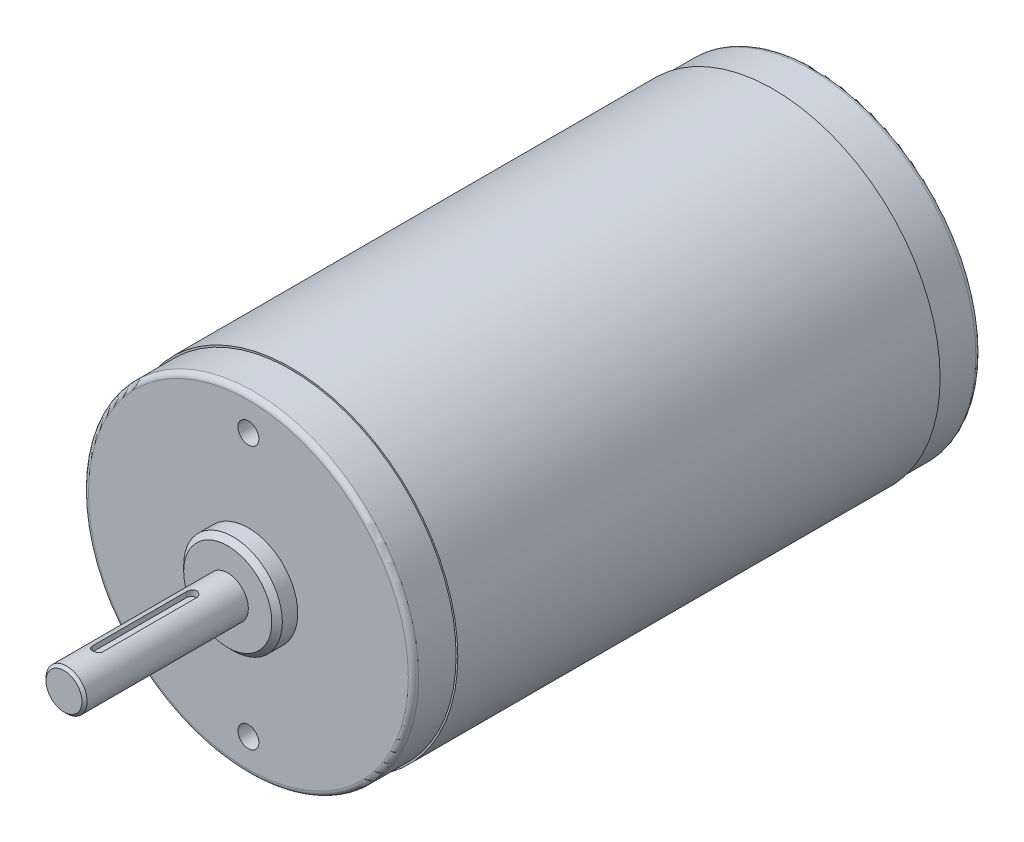
ISO-10303-21;
HEADER;
FILE_DESCRIPTION(('STEP AP214'),'2;1');
FILE_NAME('part.step','',(''),(''),'','','');
FILE_SCHEMA(('AUTOMOTIVE_DESIGN { 1 0 10303 214 1 1 1 1 }'));
ENDSEC;
DATA;
#1=APPLICATION_CONTEXT('core data for automotive mechanical design processes');
#2=APPLICATION_PROTOCOL_DEFINITION('international standard','automotive_design',2000,#1);
#3=PRODUCT_CONTEXT('',#1,'mechanical');
#4=PRODUCT('Part','Part','',(#3));
#5=PRODUCT_RELATED_PRODUCT_CATEGORY('part','',(#4));
#6=PRODUCT_DEFINITION_FORMATION('','',#4);
#7=PRODUCT_DEFINITION_CONTEXT('part definition',#1,'design');
#8=PRODUCT_DEFINITION('design','',#6,#7);
#9=PRODUCT_DEFINITION_SHAPE('','',#8);
#10=(LENGTH_UNIT() NAMED_UNIT(*) SI_UNIT(.MILLI.,.METRE.));
#11=(NAMED_UNIT(*) PLANE_ANGLE_UNIT() SI_UNIT($,.RADIAN.));
#12=(NAMED_UNIT(*) SI_UNIT($,.STERADIAN.) SOLID_ANGLE_UNIT());
#13=UNCERTAINTY_MEASURE_WITH_UNIT(LENGTH_MEASURE(1.E-05),#10,'distance_accuracy_value','');
#14=(GEOMETRIC_REPRESENTATION_CONTEXT(3) GLOBAL_UNCERTAINTY_ASSIGNED_CONTEXT((#13)) GLOBAL_UNIT_ASSIGNED_CONTEXT((#10,
#11,#12)) REPRESENTATION_CONTEXT('',''));
#15=CARTESIAN_POINT('',(0.,0.,0.));
#16=DIRECTION('',(0.,0.,1.));
#17=DIRECTION('',(1.,0.,0.));
#18=AXIS2_PLACEMENT_3D('',#15,#16,#17);
#19=CARTESIAN_POINT('',(0.,31.877,-113.5888));
#20=DIRECTION('',(0.,0.,1.));
#21=DIRECTION('',(1.,0.,0.));
#22=AXIS2_PLACEMENT_3D('',#19,#20,#21);
#23=PLANE('',#22);
#24=CARTESIAN_POINT('',(-11.1850818728217,18.6151022693478,-113.5888));
#25=DIRECTION('',(0.,0.,1.));
#26=DIRECTION('',(1.,0.,0.));
#27=AXIS2_PLACEMENT_3D('',#24,#25,#26);
#28=CIRCLE('',#27,4.318);
#29=CARTESIAN_POINT('',(-6.86708187282167,18.6151022693478,-113.5888));
#30=VERTEX_POINT('',#29);
#31=EDGE_CURVE('E46',#30,#30,#28,.F.);
#32=ORIENTED_EDGE('',*,*,#31,.F.);
#33=EDGE_LOOP('',(#32));
#34=FACE_BOUND('',#33,.T.);
#35=CARTESIAN_POINT('',(0.,0.,-113.5888));
#36=DIRECTION('',(0.,0.,1.));
#37=DIRECTION('',(1.,0.,0.));
#38=AXIS2_PLACEMENT_3D('',#35,#36,#37);
#39=CIRCLE('',#38,30.877);
#40=CARTESIAN_POINT('',(30.877,0.,-113.5888));
#41=VERTEX_POINT('',#40);
#42=EDGE_CURVE('E149',#41,#41,#39,.F.);
#43=ORIENTED_EDGE('',*,*,#42,.T.);
#44=EDGE_LOOP('',(#43));
#45=FACE_BOUND('',#44,.T.);
#46=CARTESIAN_POINT('',(0.,0.,-113.5888));
#47=DIRECTION('',(0.,0.,1.));
#48=DIRECTION('',(1.,0.,0.));
#49=AXIS2_PLACEMENT_3D('',#46,#47,#48);
#50=CIRCLE('',#49,15.0368);
#51=CARTESIAN_POINT('',(15.0368,0.,-113.5888));
#52=VERTEX_POINT('',#51);
#53=EDGE_CURVE('E125',#52,#52,#50,.T.);
#54=ORIENTED_EDGE('',*,*,#53,.T.);
#55=EDGE_LOOP('',(#54));
#56=FACE_BOUND('',#55,.T.);
#57=CARTESIAN_POINT('',(-18.6151022693478,11.1850818728216,-113.5888));
#58=DIRECTION('',(0.,0.,1.));
#59=DIRECTION('',(1.,0.,0.));
#60=AXIS2_PLACEMENT_3D('',#57,#58,#59);
#61=CIRCLE('',#60,4.318);
#62=CARTESIAN_POINT('',(-14.2971022693478,11.1850818728216,-113.5888));
#63=VERTEX_POINT('',#62);
#64=EDGE_CURVE('E11',#63,#63,#61,.F.);
#65=ORIENTED_EDGE('',*,*,#64,.F.);
#66=EDGE_LOOP('',(#65));
#67=FACE_BOUND('',#66,.T.);
#68=ADVANCED_FACE('F38',(#34,#45,#56,#67),#23,.F.);
#69=CARTESIAN_POINT('',(0.,0.,31.623));
#70=DIRECTION('',(0.,0.,-1.));
#71=DIRECTION('',(-1.,0.,0.));
#72=AXIS2_PLACEMENT_3D('',#69,#70,#71);
#73=PLANE('',#72);
#74=CARTESIAN_POINT('',(0.,0.,31.623));
#75=DIRECTION('',(0.,0.,-1.));
#76=DIRECTION('',(-1.,0.,0.));
#77=AXIS2_PLACEMENT_3D('',#74,#75,#76);
#78=CIRCLE('',#77,3.47510000000003);
#79=CARTESIAN_POINT('',(-3.47510000000003,0.,31.623));
#80=VERTEX_POINT('',#79);
#81=EDGE_CURVE('E170',#80,#80,#78,.F.);
#82=ORIENTED_EDGE('',*,*,#81,.T.);
#83=EDGE_LOOP('',(#82));
#84=FACE_BOUND('',#83,.T.);
#85=ADVANCED_FACE('F222',(#84),#73,.F.);
#86=CARTESIAN_POINT('',(0.,0.,111.866494726052));
#87=DIRECTION('',(0.,0.,1.));
#88=DIRECTION('',(1.,0.,0.));
#89=AXIS2_PLACEMENT_3D('',#86,#87,#88);
#90=CYLINDRICAL_SURFACE('',#89,3.9751);
#91=DIRECTION('',(0.,0.,1.));
#92=VECTOR('',#91,1.);
#93=CARTESIAN_POINT('',(-0.999490000000012,3.84739389066157,111.866494726052));
#94=LINE('',#93,#92);
#95=CARTESIAN_POINT('',(-0.999490000000002,3.84739389066157,25.09393));
#96=VERTEX_POINT('',#95);
#97=CARTESIAN_POINT('',(-0.99949,3.84739389066157,6.99389));
#98=VERTEX_POINT('',#97);
#99=EDGE_CURVE('E189',#96,#98,#94,.F.);
#100=ORIENTED_EDGE('',*,*,#99,.T.);
#101=CARTESIAN_POINT('',(-0.99949,3.84739389066157,6.99389));
#102=CARTESIAN_POINT('',(-0.999490343381308,3.8473920181115,6.96624660485243));
#103=CARTESIAN_POINT('',(-0.998342448217711,3.84769219472429,6.9386169129116));
#104=CARTESIAN_POINT('',(-0.993766503056189,3.84887729877351,6.88356427524025));
#105=CARTESIAN_POINT('',(-0.990338840053046,3.84976212696408,6.8561412952189));
#106=CARTESIAN_POINT('',(-0.976686297375432,3.85325802345764,6.77459379441145));
#107=CARTESIAN_POINT('',(-0.963091643256898,3.85671072402567,6.72102982738385));
#108=CARTESIAN_POINT('',(-0.927356949827813,3.86545763452847,6.61703857790982));
#109=CARTESIAN_POINT('',(-0.905217770127287,3.87075165921411,6.56661098052568));
#110=CARTESIAN_POINT('',(-0.85304929208549,3.88258162245654,6.47016009313009));
#111=CARTESIAN_POINT('',(-0.823017836794074,3.88911790038437,6.42413801183939));
#112=CARTESIAN_POINT('',(-0.755211368536713,3.90285700660392,6.33681077481703));
#113=CARTESIAN_POINT('',(-0.717294003960189,3.91007051997266,6.29561785872324));
#114=CARTESIAN_POINT('',(-0.635095100783287,3.92425930132188,6.22010074654109));
#115=CARTESIAN_POINT('',(-0.590812545589344,3.93123453102508,6.18577764974018));
#116=CARTESIAN_POINT('',(-0.496367579344913,3.94427940521958,6.12451583290973));
#117=CARTESIAN_POINT('',(-0.446130988567747,3.95033487574501,6.09768819630616));
#118=CARTESIAN_POINT('',(-0.341685942109306,3.96073487028167,6.05290223136462));
#119=CARTESIAN_POINT('',(-0.287478276859873,3.96507973369311,6.03494214344343));
#120=CARTESIAN_POINT('',(-0.177805168599244,3.9714933735354,6.00876128510268));
#121=CARTESIAN_POINT('',(-0.122388179838444,3.97360691689222,6.00034869361091));
#122=CARTESIAN_POINT('',(-0.0108906250515875,3.97547584784663,5.99289933101057));
#123=CARTESIAN_POINT('',(0.0451898555511955,3.97523153578354,5.99386136577937));
#124=CARTESIAN_POINT('',(0.155089151279945,3.97244547098542,6.00499659245638));
#125=CARTESIAN_POINT('',(0.208930476121442,3.96995541867523,6.01496251002972));
#126=CARTESIAN_POINT('',(0.314150158804952,3.9630179639741,6.04348918980516));
#127=CARTESIAN_POINT('',(0.36552840684914,3.95857047441531,6.06205033476867));
#128=CARTESIAN_POINT('',(0.464909318541839,3.94813892179605,6.1074077795047));
#129=CARTESIAN_POINT('',(0.512876879695035,3.94214120031962,6.13427772028273));
#130=CARTESIAN_POINT('',(0.603693451036629,3.92925961138905,6.19543360284162));
#131=CARTESIAN_POINT('',(0.646541677963807,3.92237560866724,6.22972067719859));
#132=CARTESIAN_POINT('',(0.727136245277363,3.90824954837472,6.30584301121543));
#133=CARTESIAN_POINT('',(0.764711621366916,3.90100284589063,6.34785859055966));
#134=CARTESIAN_POINT('',(0.832330340627265,3.88713794728399,6.43768265952907));
#135=CARTESIAN_POINT('',(0.86237162079384,3.88051992361527,6.48549273051177));
#136=CARTESIAN_POINT('',(0.914182904910808,3.86864352215989,6.58589479391042));
#137=CARTESIAN_POINT('',(0.935906633198786,3.86339280178735,6.63851157872597));
#138=CARTESIAN_POINT('',(0.970118778767975,3.85494556552529,6.74678340361034));
#139=CARTESIAN_POINT('',(0.982621006766666,3.85174597866952,6.80243376559792));
#140=CARTESIAN_POINT('',(0.993366859861364,3.8489802595001,6.88112091104182));
#141=CARTESIAN_POINT('',(0.995663418329813,3.84838629979331,6.90362800905635));
#142=CARTESIAN_POINT('',(0.998723272563294,3.84759328590928,6.9487164977706));
#143=CARTESIAN_POINT('',(0.999489044854608,3.84739359388698,6.97129770917706));
#144=CARTESIAN_POINT('',(0.99949,3.84739389066157,6.99389));
#145=B_SPLINE_CURVE_WITH_KNOTS('',3,(#101,#102,#103,#104,#105,#106,#107,#108,#109,#110,#111,
#112,#113,#114,#115,#116,#117,#118,#119,#120,#121,#122,#123,#124,#125,#126,#127,#128,#129,#130,
#131,#132,#133,#134,#135,#136,#137,#138,#139,#140,#141,#142,#143,#144),.UNSPECIFIED.,.F.,.F.,(4,
2,2,2,2,2,2,2,2,2,2,2,2,2,2,2,2,2,2,2,2,4),(0.,0.0828777794645352,0.165741493863067,
0.330992570166975,0.496227025949619,0.661506687172767,0.830079138702128,0.998678543151512,
1.16965802381187,1.34060356345095,1.5080501726355,1.67547545305815,1.83914205422299,
2.00281594446593,2.167984203063,2.33317770022889,2.50287539431904,2.67261950482898,
2.8432947390248,3.01371383698304,3.08156469810441,3.14930570007196),.UNSPECIFIED.);
#146=CARTESIAN_POINT('',(0.99949,3.84739389066158,6.99389));
#147=VERTEX_POINT('',#146);
#148=EDGE_CURVE('E211',#98,#147,#145,.T.);
#149=ORIENTED_EDGE('',*,*,#148,.T.);
#150=DIRECTION('',(0.,0.,1.));
#151=VECTOR('',#150,1.);
#152=CARTESIAN_POINT('',(0.999489999999984,3.84739389066158,111.866494726052));
#153=LINE('',#152,#151);
#154=CARTESIAN_POINT('',(0.999489999999984,3.84739389066158,25.09393));
#155=VERTEX_POINT('',#154);
#156=EDGE_CURVE('E85',#147,#155,#153,.T.);
#157=ORIENTED_EDGE('',*,*,#156,.T.);
#158=CARTESIAN_POINT('',(0.999489999999997,3.84739389066157,25.09393));
#159=CARTESIAN_POINT('',(0.999490343381305,3.8473920181115,25.1215733951476));
#160=CARTESIAN_POINT('',(0.998342448217708,3.84769219472429,25.1492030870884));
#161=CARTESIAN_POINT('',(0.993766503056185,3.84887729877351,25.2042557247598));
#162=CARTESIAN_POINT('',(0.990338840053042,3.84976212696409,25.2316787047811));
#163=CARTESIAN_POINT('',(0.976686297375429,3.85325802345764,25.3132262055885));
#164=CARTESIAN_POINT('',(0.963091643256895,3.85671072402567,25.3667901726161));
#165=CARTESIAN_POINT('',(0.927356949827811,3.86545763452847,25.4707814220902));
#166=CARTESIAN_POINT('',(0.905217770127285,3.87075165921411,25.5212090194743));
#167=CARTESIAN_POINT('',(0.853049292085487,3.88258162245654,25.6176599068699));
#168=CARTESIAN_POINT('',(0.823017836794071,3.88911790038437,25.6636819881606));
#169=CARTESIAN_POINT('',(0.755211368536709,3.90285700660392,25.751009225183));
#170=CARTESIAN_POINT('',(0.717294003960184,3.91007051997266,25.7922021412768));
#171=CARTESIAN_POINT('',(0.635095100783281,3.92425930132188,25.8677192534589));
#172=CARTESIAN_POINT('',(0.590812545589338,3.93123453102508,25.9020423502598));
#173=CARTESIAN_POINT('',(0.496367579344908,3.94427940521958,25.9633041670903));
#174=CARTESIAN_POINT('',(0.446130988567742,3.95033487574501,25.9901318036938));
#175=CARTESIAN_POINT('',(0.341685942109302,3.96073487028167,26.0349177686354));
#176=CARTESIAN_POINT('',(0.287478276859869,3.96507973369311,26.0528778565566));
#177=CARTESIAN_POINT('',(0.177805168599242,3.9714933735354,26.0790587148973));
#178=CARTESIAN_POINT('',(0.122388179838441,3.97360691689222,26.0874713063891));
#179=CARTESIAN_POINT('',(0.010890625051585,3.97547584784663,26.0949206689894));
#180=CARTESIAN_POINT('',(-0.045189855551198,3.97523153578354,26.0939586342206));
#181=CARTESIAN_POINT('',(-0.155089151279948,3.97244547098542,26.0828234075436));
#182=CARTESIAN_POINT('',(-0.208930476121444,3.96995541867523,26.0728574899703));
#183=CARTESIAN_POINT('',(-0.314150158804955,3.9630179639741,26.0443308101948));
#184=CARTESIAN_POINT('',(-0.365528406849143,3.95857047441531,26.0257696652313));
#185=CARTESIAN_POINT('',(-0.464909318541841,3.94813892179605,25.9804122204953));
#186=CARTESIAN_POINT('',(-0.512876879695037,3.94214120031962,25.9535422797173));
#187=CARTESIAN_POINT('',(-0.603693451036631,3.92925961138905,25.8923863971584));
#188=CARTESIAN_POINT('',(-0.64654167796381,3.92237560866724,25.8580993228014));
#189=CARTESIAN_POINT('',(-0.727136245277367,3.90824954837472,25.7819769887846));
#190=CARTESIAN_POINT('',(-0.764711621366919,3.90100284589063,25.7399614094403));
#191=CARTESIAN_POINT('',(-0.832330340627268,3.88713794728399,25.6501373404709));
#192=CARTESIAN_POINT('',(-0.862371620793843,3.88051992361527,25.6023272694882));
#193=CARTESIAN_POINT('',(-0.914182904910811,3.86864352215989,25.5019252060896));
#194=CARTESIAN_POINT('',(-0.935906633198789,3.86339280178735,25.449308421274));
#195=CARTESIAN_POINT('',(-0.970118778767978,3.85494556552529,25.3410365963897));
#196=CARTESIAN_POINT('',(-0.98262100676667,3.85174597866952,25.2853862344021));
#197=CARTESIAN_POINT('',(-0.993366859861367,3.8489802595001,25.2066990889582));
#198=CARTESIAN_POINT('',(-0.995663418329815,3.84838629979331,25.1841919909436));
#199=CARTESIAN_POINT('',(-0.998723272563297,3.84759328590928,25.1391035022294));
#200=CARTESIAN_POINT('',(-0.99948904485461,3.84739359388698,25.1165222908229));
#201=CARTESIAN_POINT('',(-0.999490000000002,3.84739389066157,25.09393));
#202=B_SPLINE_CURVE_WITH_KNOTS('',3,(#158,#159,#160,#161,#162,#163,#164,#165,#166,#167,#168,
#169,#170,#171,#172,#173,#174,#175,#176,#177,#178,#179,#180,#181,#182,#183,#184,#185,#186,#187,
#188,#189,#190,#191,#192,#193,#194,#195,#196,#197,#198,#199,#200,#201),.UNSPECIFIED.,.F.,.F.,(4,
2,2,2,2,2,2,2,2,2,2,2,2,2,2,2,2,2,2,2,2,4),(0.,0.0828777794645343,0.165741493863063,
0.330992570166974,0.496227025949618,0.661506687172766,0.830079138702133,0.998678543151515,
1.16965802381187,1.34060356345095,1.5080501726355,1.67547545305815,1.83914205422299,
2.00281594446593,2.167984203063,2.33317770022888,2.50287539431904,2.67261950482898,
2.8432947390248,3.01371383698304,3.0815646981044,3.14930570007196),.UNSPECIFIED.);
#203=EDGE_CURVE('E181',#155,#96,#202,.T.);
#204=ORIENTED_EDGE('',*,*,#203,.T.);
#205=EDGE_LOOP('',(#100,#149,#157,#204));
#206=FACE_BOUND('',#205,.T.);
#207=CARTESIAN_POINT('',(0.,0.,31.123));
#208=DIRECTION('',(0.,0.,-1.));
#209=DIRECTION('',(-1.,0.,0.));
#210=AXIS2_PLACEMENT_3D('',#207,#208,#209);
#211=CIRCLE('',#210,3.9751);
#212=CARTESIAN_POINT('',(-3.9751,0.,31.123));
#213=VERTEX_POINT('',#212);
#214=EDGE_CURVE('E173',#213,#213,#211,.T.);
#215=ORIENTED_EDGE('',*,*,#214,.T.);
#216=EDGE_LOOP('',(#215));
#217=FACE_BOUND('',#216,.T.);
#218=CARTESIAN_POINT('',(0.,0.,0.));
#219=DIRECTION('',(0.,0.,1.));
#220=DIRECTION('',(1.,0.,0.));
#221=AXIS2_PLACEMENT_3D('',#218,#219,#220);
#222=CIRCLE('',#221,3.9751);
#223=CARTESIAN_POINT('',(3.9751,0.,0.));
#224=VERTEX_POINT('',#223);
#225=EDGE_CURVE('E143',#224,#224,#222,.T.);
#226=ORIENTED_EDGE('',*,*,#225,.T.);
#227=EDGE_LOOP('',(#226));
#228=FACE_BOUND('',#227,.T.);
#229=ADVANCED_FACE('F191',(#206,#217,#228),#90,.T.);
#230=CARTESIAN_POINT('',(0.,3.9751,0.));
#231=DIRECTION('',(0.,0.,-1.));
#232=DIRECTION('',(-1.,0.,0.));
#233=AXIS2_PLACEMENT_3D('',#230,#231,#232);
#234=PLANE('',#233);
#235=CARTESIAN_POINT('',(0.,0.,0.));
#236=DIRECTION('',(0.,0.,-1.));
#237=DIRECTION('',(-1.,0.,0.));
#238=AXIS2_PLACEMENT_3D('',#235,#236,#237);
#239=CIRCLE('',#238,8.50900000000002);
#240=CARTESIAN_POINT('',(-8.50900000000002,0.,0.));
#241=VERTEX_POINT('',#240);
#242=EDGE_CURVE('E164',#241,#241,#239,.F.);
#243=ORIENTED_EDGE('',*,*,#242,.T.);
#244=EDGE_LOOP('',(#243));
#245=FACE_BOUND('',#244,.T.);
#246=ORIENTED_EDGE('',*,*,#225,.F.);
#247=EDGE_LOOP('',(#246));
#248=FACE_BOUND('',#247,.T.);
#249=ADVANCED_FACE('F463',(#245,#248),#234,.F.);
#250=CARTESIAN_POINT('',(0.,0.,111.866494726052));
#251=DIRECTION('',(0.,0.,1.));
#252=DIRECTION('',(1.,0.,0.));
#253=AXIS2_PLACEMENT_3D('',#250,#251,#252);
#254=CYLINDRICAL_SURFACE('',#253,9.525);
#255=CARTESIAN_POINT('',(0.,0.,-1.01599999999999));
#256=DIRECTION('',(0.,0.,-1.));
#257=DIRECTION('',(-1.,0.,0.));
#258=AXIS2_PLACEMENT_3D('',#255,#256,#257);
#259=CIRCLE('',#258,9.525);
#260=CARTESIAN_POINT('',(-9.525,0.,-1.01599999999999));
#261=VERTEX_POINT('',#260);
#262=EDGE_CURVE('E167',#261,#261,#259,.T.);
#263=ORIENTED_EDGE('',*,*,#262,.T.);
#264=EDGE_LOOP('',(#263));
#265=FACE_BOUND('',#264,.T.);
#266=CARTESIAN_POINT('',(0.,0.,-3.9878));
#267=DIRECTION('',(0.,0.,1.));
#268=DIRECTION('',(1.,0.,0.));
#269=AXIS2_PLACEMENT_3D('',#266,#267,#268);
#270=CIRCLE('',#269,9.525);
#271=CARTESIAN_POINT('',(9.525,0.,-3.9878));
#272=VERTEX_POINT('',#271);
#273=EDGE_CURVE('E140',#272,#272,#270,.T.);
#274=ORIENTED_EDGE('',*,*,#273,.T.);
#275=EDGE_LOOP('',(#274));
#276=FACE_BOUND('',#275,.T.);
#277=ADVANCED_FACE('F455',(#265,#276),#254,.T.);
#278=CARTESIAN_POINT('',(0.,9.525,-3.9878));
#279=DIRECTION('',(0.,0.,-1.));
#280=DIRECTION('',(-1.,0.,0.));
#281=AXIS2_PLACEMENT_3D('',#278,#279,#280);
#282=PLANE('',#281);
#283=CARTESIAN_POINT('',(0.,25.4,-3.9878));
#284=DIRECTION('',(0.,0.,-1.));
#285=DIRECTION('',(-1.,0.,0.));
#286=AXIS2_PLACEMENT_3D('',#283,#284,#285);
#287=CIRCLE('',#286,2.0193);
#288=CARTESIAN_POINT('',(-2.0193,25.4,-3.9878));
#289=VERTEX_POINT('',#288);
#290=EDGE_CURVE('E120',#289,#289,#287,.T.);
#291=ORIENTED_EDGE('',*,*,#290,.T.);
#292=EDGE_LOOP('',(#291));
#293=FACE_BOUND('',#292,.T.);
#294=CARTESIAN_POINT('',(0.,-25.4,-3.9878));
#295=DIRECTION('',(0.,0.,-1.));
#296=DIRECTION('',(-1.,0.,0.));
#297=AXIS2_PLACEMENT_3D('',#294,#295,#296);
#298=CIRCLE('',#297,2.0193);
#299=CARTESIAN_POINT('',(-2.0193,-25.4,-3.9878));
#300=VERTEX_POINT('',#299);
#301=EDGE_CURVE('E124',#300,#300,#298,.T.);
#302=ORIENTED_EDGE('',*,*,#301,.T.);
#303=EDGE_LOOP('',(#302));
#304=FACE_BOUND('',#303,.T.);
#305=CARTESIAN_POINT('',(0.,0.,-3.9878));
#306=DIRECTION('',(0.,0.,-1.));
#307=DIRECTION('',(-1.,0.,0.));
#308=AXIS2_PLACEMENT_3D('',#305,#306,#307);
#309=CIRCLE('',#308,30.877);
#310=CARTESIAN_POINT('',(-30.877,0.,-3.9878));
#311=VERTEX_POINT('',#310);
#312=EDGE_CURVE('E152',#311,#311,#309,.F.);
#313=ORIENTED_EDGE('',*,*,#312,.T.);
#314=EDGE_LOOP('',(#313));
#315=FACE_BOUND('',#314,.T.);
#316=ORIENTED_EDGE('',*,*,#273,.F.);
#317=EDGE_LOOP('',(#316));
#318=FACE_BOUND('',#317,.T.);
#319=ADVANCED_FACE('F447',(#293,#304,#315,#318),#282,.F.);
#320=CARTESIAN_POINT('',(0.,0.,111.866494726052));
#321=DIRECTION('',(0.,0.,1.));
#322=DIRECTION('',(1.,0.,0.));
#323=AXIS2_PLACEMENT_3D('',#320,#321,#322);
#324=CYLINDRICAL_SURFACE('',#323,31.877);
#325=CARTESIAN_POINT('',(0.,0.,-4.9878));
#326=DIRECTION('',(0.,0.,-1.));
#327=DIRECTION('',(-1.,0.,0.));
#328=AXIS2_PLACEMENT_3D('',#325,#326,#327);
#329=CIRCLE('',#328,31.877);
#330=CARTESIAN_POINT('',(-31.877,0.,-4.9878));
#331=VERTEX_POINT('',#330);
#332=EDGE_CURVE('E155',#331,#331,#329,.T.);
#333=ORIENTED_EDGE('',*,*,#332,.T.);
#334=EDGE_LOOP('',(#333));
#335=FACE_BOUND('',#334,.T.);
#336=CARTESIAN_POINT('',(0.,0.,-12.2174));
#337=DIRECTION('',(0.,0.,1.));
#338=DIRECTION('',(1.,0.,0.));
#339=AXIS2_PLACEMENT_3D('',#336,#337,#338);
#340=CIRCLE('',#339,31.877);
#341=CARTESIAN_POINT('',(31.877,0.,-12.2174));
#342=VERTEX_POINT('',#341);
#343=EDGE_CURVE('E137',#342,#342,#340,.T.);
#344=ORIENTED_EDGE('',*,*,#343,.T.);
#345=EDGE_LOOP('',(#344));
#346=FACE_BOUND('',#345,.T.);
#347=ADVANCED_FACE('F439',(#335,#346),#324,.T.);
#348=CARTESIAN_POINT('',(0.,31.877,-12.2174));
#349=DIRECTION('',(0.,0.,-1.));
#350=DIRECTION('',(-1.,0.,0.));
#351=AXIS2_PLACEMENT_3D('',#348,#349,#350);
#352=PLANE('',#351);
#353=ORIENTED_EDGE('',*,*,#343,.F.);
#354=EDGE_LOOP('',(#353));
#355=FACE_BOUND('',#354,.T.);
#356=CARTESIAN_POINT('',(0.,0.,-12.2174));
#357=DIRECTION('',(0.,0.,1.));
#358=DIRECTION('',(1.,0.,0.));
#359=AXIS2_PLACEMENT_3D('',#356,#357,#358);
#360=CIRCLE('',#359,32.2072);
#361=CARTESIAN_POINT('',(32.2072,0.,-12.2174));
#362=VERTEX_POINT('',#361);
#363=EDGE_CURVE('E134',#362,#362,#360,.T.);
#364=ORIENTED_EDGE('',*,*,#363,.T.);
#365=EDGE_LOOP('',(#364));
#366=FACE_BOUND('',#365,.T.);
#367=ADVANCED_FACE('F429',(#355,#366),#352,.F.);
#368=CARTESIAN_POINT('',(0.,0.,111.866494726052));
#369=DIRECTION('',(0.,0.,1.));
#370=DIRECTION('',(1.,0.,0.));
#371=AXIS2_PLACEMENT_3D('',#368,#369,#370);
#372=CYLINDRICAL_SURFACE('',#371,32.2072);
#373=ORIENTED_EDGE('',*,*,#363,.F.);
#374=EDGE_LOOP('',(#373));
#375=FACE_BOUND('',#374,.T.);
#376=CARTESIAN_POINT('',(0.,0.,-105.3592));
#377=DIRECTION('',(0.,0.,1.));
#378=DIRECTION('',(1.,0.,0.));
#379=AXIS2_PLACEMENT_3D('',#376,#377,#378);
#380=CIRCLE('',#379,32.2072);
#381=CARTESIAN_POINT('',(32.2072,0.,-105.3592));
#382=VERTEX_POINT('',#381);
#383=EDGE_CURVE('E131',#382,#382,#380,.T.);
#384=ORIENTED_EDGE('',*,*,#383,.T.);
#385=EDGE_LOOP('',(#384));
#386=FACE_BOUND('',#385,.T.);
#387=ADVANCED_FACE('F420',(#375,#386),#372,.T.);
#388=CARTESIAN_POINT('',(0.,32.2072,-105.3592));
#389=DIRECTION('',(0.,0.,1.));
#390=DIRECTION('',(1.,0.,0.));
#391=AXIS2_PLACEMENT_3D('',#388,#389,#390);
#392=PLANE('',#391);
#393=ORIENTED_EDGE('',*,*,#383,.F.);
#394=EDGE_LOOP('',(#393));
#395=FACE_BOUND('',#394,.T.);
#396=CARTESIAN_POINT('',(0.,0.,-105.3592));
#397=DIRECTION('',(0.,0.,1.));
#398=DIRECTION('',(1.,0.,0.));
#399=AXIS2_PLACEMENT_3D('',#396,#397,#398);
#400=CIRCLE('',#399,31.877);
#401=CARTESIAN_POINT('',(31.877,0.,-105.3592));
#402=VERTEX_POINT('',#401);
#403=EDGE_CURVE('E128',#402,#402,#400,.T.);
#404=ORIENTED_EDGE('',*,*,#403,.T.);
#405=EDGE_LOOP('',(#404));
#406=FACE_BOUND('',#405,.T.);
#407=ADVANCED_FACE('F410',(#395,#406),#392,.F.);
#408=CARTESIAN_POINT('',(0.,0.,111.866494726052));
#409=DIRECTION('',(0.,0.,1.));
#410=DIRECTION('',(1.,0.,0.));
#411=AXIS2_PLACEMENT_3D('',#408,#409,#410);
#412=CYLINDRICAL_SURFACE('',#411,31.877);
#413=CARTESIAN_POINT('',(0.,0.,-112.5888));
#414=DIRECTION('',(0.,0.,1.));
#415=DIRECTION('',(1.,0.,0.));
#416=AXIS2_PLACEMENT_3D('',#413,#414,#415);
#417=CIRCLE('',#416,31.877);
#418=CARTESIAN_POINT('',(31.877,0.,-112.5888));
#419=VERTEX_POINT('',#418);
#420=EDGE_CURVE('E146',#419,#419,#417,.T.);
#421=ORIENTED_EDGE('',*,*,#420,.T.);
#422=EDGE_LOOP('',(#421));
#423=FACE_BOUND('',#422,.T.);
#424=ORIENTED_EDGE('',*,*,#403,.F.);
#425=EDGE_LOOP('',(#424));
#426=FACE_BOUND('',#425,.T.);
#427=ADVANCED_FACE('F401',(#423,#426),#412,.T.);
#428=CARTESIAN_POINT('',(0.,0.,111.866494726052));
#429=DIRECTION('',(0.,0.,1.));
#430=DIRECTION('',(1.,0.,0.));
#431=AXIS2_PLACEMENT_3D('',#428,#429,#430);
#432=CYLINDRICAL_SURFACE('',#431,15.0368);
#433=CARTESIAN_POINT('',(0.,0.,-117.5728));
#434=DIRECTION('',(0.,0.,1.));
#435=DIRECTION('',(1.,0.,0.));
#436=AXIS2_PLACEMENT_3D('',#433,#434,#435);
#437=CIRCLE('',#436,15.0368);
#438=CARTESIAN_POINT('',(15.0368,0.,-117.5728));
#439=VERTEX_POINT('',#438);
#440=EDGE_CURVE('E158',#439,#439,#437,.T.);
#441=ORIENTED_EDGE('',*,*,#440,.T.);
#442=EDGE_LOOP('',(#441));
#443=FACE_BOUND('',#442,.T.);
#444=ORIENTED_EDGE('',*,*,#53,.F.);
#445=EDGE_LOOP('',(#444));
#446=FACE_BOUND('',#445,.T.);
#447=ADVANCED_FACE('F392',(#443,#446),#432,.T.);
#448=CARTESIAN_POINT('',(0.,15.0368,-118.5888));
#449=DIRECTION('',(0.,0.,1.));
#450=DIRECTION('',(1.,0.,0.));
#451=AXIS2_PLACEMENT_3D('',#448,#449,#450);
#452=PLANE('',#451);
#453=CARTESIAN_POINT('',(0.,0.,-118.5888));
#454=DIRECTION('',(0.,0.,1.));
#455=DIRECTION('',(1.,0.,0.));
#456=AXIS2_PLACEMENT_3D('',#453,#454,#455);
#457=CIRCLE('',#456,14.0208);
#458=CARTESIAN_POINT('',(14.0208,0.,-118.5888));
#459=VERTEX_POINT('',#458);
#460=EDGE_CURVE('E161',#459,#459,#457,.F.);
#461=ORIENTED_EDGE('',*,*,#460,.T.);
#462=EDGE_LOOP('',(#461));
#463=FACE_BOUND('',#462,.T.);
#464=ADVANCED_FACE('F383',(#463),#452,.F.);
#465=CARTESIAN_POINT('',(0.,0.,-112.5888));
#466=DIRECTION('',(0.,0.,1.));
#467=DIRECTION('',(1.,0.,0.));
#468=AXIS2_PLACEMENT_3D('',#465,#466,#467);
#469=TOROIDAL_SURFACE('',#468,30.877,1.);
#470=ORIENTED_EDGE('',*,*,#42,.F.);
#471=EDGE_LOOP('',(#470));
#472=FACE_BOUND('',#471,.T.);
#473=ORIENTED_EDGE('',*,*,#420,.F.);
#474=EDGE_LOOP('',(#473));
#475=FACE_BOUND('',#474,.T.);
#476=ADVANCED_FACE('F373',(#472,#475),#469,.T.);
#477=CARTESIAN_POINT('',(0.,0.,-4.9878));
#478=DIRECTION('',(0.,0.,-1.));
#479=DIRECTION('',(-1.,0.,0.));
#480=AXIS2_PLACEMENT_3D('',#477,#478,#479);
#481=TOROIDAL_SURFACE('',#480,30.877,1.);
#482=ORIENTED_EDGE('',*,*,#332,.F.);
#483=EDGE_LOOP('',(#482));
#484=FACE_BOUND('',#483,.T.);
#485=ORIENTED_EDGE('',*,*,#312,.F.);
#486=EDGE_LOOP('',(#485));
#487=FACE_BOUND('',#486,.T.);
#488=ADVANCED_FACE('F363',(#484,#487),#481,.T.);
#489=CARTESIAN_POINT('',(0.,0.,-117.5728));
#490=DIRECTION('',(0.,0.,1.));
#491=DIRECTION('',(1.,0.,0.));
#492=AXIS2_PLACEMENT_3D('',#489,#490,#491);
#493=CONICAL_SURFACE('',#492,15.0368,0.785398163397453);
#494=ORIENTED_EDGE('',*,*,#460,.F.);
#495=EDGE_LOOP('',(#494));
#496=FACE_BOUND('',#495,.T.);
#497=ORIENTED_EDGE('',*,*,#440,.F.);
#498=EDGE_LOOP('',(#497));
#499=FACE_BOUND('',#498,.T.);
#500=ADVANCED_FACE('F355',(#496,#499),#493,.T.);
#501=CARTESIAN_POINT('',(0.,0.,0.));
#502=DIRECTION('',(0.,0.,-1.));
#503=DIRECTION('',(-1.,0.,0.));
#504=AXIS2_PLACEMENT_3D('',#501,#502,#503);
#505=CONICAL_SURFACE('',#504,8.50900000000002,0.785398163397446);
#506=ORIENTED_EDGE('',*,*,#262,.F.);
#507=EDGE_LOOP('',(#506));
#508=FACE_BOUND('',#507,.T.);
#509=ORIENTED_EDGE('',*,*,#242,.F.);
#510=EDGE_LOOP('',(#509));
#511=FACE_BOUND('',#510,.T.);
#512=ADVANCED_FACE('F346',(#508,#511),#505,.T.);
#513=CARTESIAN_POINT('',(0.,0.,31.623));
#514=DIRECTION('',(0.,0.,-1.));
#515=DIRECTION('',(-1.,0.,0.));
#516=AXIS2_PLACEMENT_3D('',#513,#514,#515);
#517=CONICAL_SURFACE('',#516,3.47510000000002,0.785398163397425);
#518=ORIENTED_EDGE('',*,*,#214,.F.);
#519=EDGE_LOOP('',(#518));
#520=FACE_BOUND('',#519,.T.);
#521=ORIENTED_EDGE('',*,*,#81,.F.);
#522=EDGE_LOOP('',(#521));
#523=FACE_BOUND('',#522,.T.);
#524=ADVANCED_FACE('F40',(#520,#523),#517,.T.);
#525=CARTESIAN_POINT('',(0.,-25.4,0.));
#526=DIRECTION('',(0.,0.,1.));
#527=DIRECTION('',(1.,0.,0.));
#528=AXIS2_PLACEMENT_3D('',#525,#526,#527);
#529=CYLINDRICAL_SURFACE('',#528,2.0193);
#530=CARTESIAN_POINT('',(0.,-25.4,-13.6144));
#531=DIRECTION('',(0.,0.,1.));
#532=DIRECTION('',(1.,0.,0.));
#533=AXIS2_PLACEMENT_3D('',#530,#531,#532);
#534=CIRCLE('',#533,2.0193);
#535=CARTESIAN_POINT('',(2.0193,-25.4,-13.6144));
#536=VERTEX_POINT('',#535);
#537=EDGE_CURVE('E121',#536,#536,#534,.T.);
#538=ORIENTED_EDGE('',*,*,#537,.F.);
#539=EDGE_LOOP('',(#538));
#540=FACE_BOUND('',#539,.T.);
#541=ORIENTED_EDGE('',*,*,#301,.F.);
#542=EDGE_LOOP('',(#541));
#543=FACE_BOUND('',#542,.T.);
#544=ADVANCED_FACE('F328',(#540,#543),#529,.F.);
#545=CARTESIAN_POINT('',(0.,-25.4,-13.6144));
#546=DIRECTION('',(0.,0.,1.));
#547=DIRECTION('',(1.,0.,0.));
#548=AXIS2_PLACEMENT_3D('',#545,#546,#547);
#549=CONICAL_SURFACE('',#548,2.0193,1.02974425867665);
#550=CARTESIAN_POINT('',(0.,-25.4,-14.8277178480024));
#551=VERTEX_POINT('',#550);
#552=VERTEX_LOOP('',#551);
#553=FACE_BOUND('',#552,.T.);
#554=ORIENTED_EDGE('',*,*,#537,.T.);
#555=EDGE_LOOP('',(#554));
#556=FACE_BOUND('',#555,.T.);
#557=ADVANCED_FACE('F319',(#553,#556),#549,.F.);
#558=CARTESIAN_POINT('',(0.,25.4,0.));
#559=DIRECTION('',(0.,0.,1.));
#560=DIRECTION('',(1.,0.,0.));
#561=AXIS2_PLACEMENT_3D('',#558,#559,#560);
#562=CYLINDRICAL_SURFACE('',#561,2.0193);
#563=CARTESIAN_POINT('',(0.,25.4,-13.6144));
#564=DIRECTION('',(0.,0.,1.));
#565=DIRECTION('',(1.,0.,0.));
#566=AXIS2_PLACEMENT_3D('',#563,#564,#565);
#567=CIRCLE('',#566,2.0193);
#568=CARTESIAN_POINT('',(2.0193,25.4,-13.6144));
#569=VERTEX_POINT('',#568);
#570=EDGE_CURVE('E114',#569,#569,#567,.T.);
#571=ORIENTED_EDGE('',*,*,#570,.F.);
#572=EDGE_LOOP('',(#571));
#573=FACE_BOUND('',#572,.T.);
#574=ORIENTED_EDGE('',*,*,#290,.F.);
#575=EDGE_LOOP('',(#574));
#576=FACE_BOUND('',#575,.T.);
#577=ADVANCED_FACE('F209',(#573,#576),#562,.F.);
#578=CARTESIAN_POINT('',(0.,25.4,-13.6144));
#579=DIRECTION('',(0.,0.,1.));
#580=DIRECTION('',(1.,0.,0.));
#581=AXIS2_PLACEMENT_3D('',#578,#579,#580);
#582=CONICAL_SURFACE('',#581,2.0193,1.02974425867665);
#583=CARTESIAN_POINT('',(0.,25.4,-14.8277178480024));
#584=VERTEX_POINT('',#583);
#585=VERTEX_LOOP('',#584);
#586=FACE_BOUND('',#585,.T.);
#587=ORIENTED_EDGE('',*,*,#570,.T.);
#588=EDGE_LOOP('',(#587));
#589=FACE_BOUND('',#588,.T.);
#590=ADVANCED_FACE('F208',(#586,#589),#582,.F.);
#591=CARTESIAN_POINT('',(0.,32.2072,6.99389));
#592=DIRECTION('',(0.,-1.,0.));
#593=DIRECTION('',(0.,0.,-1.));
#594=AXIS2_PLACEMENT_3D('',#591,#592,#593);
#595=CYLINDRICAL_SURFACE('',#594,0.99949);
#596=DIRECTION('',(0.,-1.,0.));
#597=VECTOR('',#596,1.);
#598=CARTESIAN_POINT('',(-0.99949,32.2072,6.99389));
#599=LINE('',#598,#597);
#600=CARTESIAN_POINT('',(-0.99949,2.82448,6.99389));
#601=VERTEX_POINT('',#600);
#602=EDGE_CURVE('E103',#98,#601,#599,.T.);
#603=ORIENTED_EDGE('',*,*,#602,.T.);
#604=CARTESIAN_POINT('',(0.,2.82448,6.99389));
#605=DIRECTION('',(0.,-1.,0.));
#606=DIRECTION('',(0.,0.,-1.));
#607=AXIS2_PLACEMENT_3D('',#604,#605,#606);
#608=CIRCLE('',#607,0.99949);
#609=CARTESIAN_POINT('',(0.99949,2.82448,6.99389));
#610=VERTEX_POINT('',#609);
#611=EDGE_CURVE('E96',#601,#610,#608,.T.);
#612=ORIENTED_EDGE('',*,*,#611,.T.);
#613=DIRECTION('',(0.,-1.,0.));
#614=VECTOR('',#613,1.);
#615=CARTESIAN_POINT('',(0.99949,32.2072,6.99389));
#616=LINE('',#615,#614);
#617=EDGE_CURVE('E80',#147,#610,#616,.T.);
#618=ORIENTED_EDGE('',*,*,#617,.F.);
#619=ORIENTED_EDGE('',*,*,#148,.F.);
#620=EDGE_LOOP('',(#603,#612,#618,#619));
#621=FACE_BOUND('',#620,.T.);
#622=ADVANCED_FACE('F101',(#621),#595,.F.);
#623=CARTESIAN_POINT('',(-0.99949,32.2072,6.99389));
#624=DIRECTION('',(-1.,0.,0.));
#625=DIRECTION('',(0.,0.,1.));
#626=AXIS2_PLACEMENT_3D('',#623,#624,#625);
#627=PLANE('',#626);
#628=DIRECTION('',(0.,-1.,0.));
#629=VECTOR('',#628,1.);
#630=CARTESIAN_POINT('',(-0.999490000000002,32.2072,25.09393));
#631=LINE('',#630,#629);
#632=CARTESIAN_POINT('',(-0.999490000000002,2.82448,25.09393));
#633=VERTEX_POINT('',#632);
#634=EDGE_CURVE('E115',#96,#633,#631,.T.);
#635=ORIENTED_EDGE('',*,*,#634,.T.);
#636=DIRECTION('',(0.,0.,-1.));
#637=VECTOR('',#636,1.);
#638=CARTESIAN_POINT('',(-0.99949,2.82448,6.99389));
#639=LINE('',#638,#637);
#640=EDGE_CURVE('E89',#633,#601,#639,.T.);
#641=ORIENTED_EDGE('',*,*,#640,.T.);
#642=ORIENTED_EDGE('',*,*,#602,.F.);
#643=ORIENTED_EDGE('',*,*,#99,.F.);
#644=EDGE_LOOP('',(#635,#641,#642,#643));
#645=FACE_BOUND('',#644,.T.);
#646=ADVANCED_FACE('F200',(#645),#627,.F.);
#647=CARTESIAN_POINT('',(0.,32.2072,25.09393));
#648=DIRECTION('',(0.,-1.,0.));
#649=DIRECTION('',(0.,0.,-1.));
#650=AXIS2_PLACEMENT_3D('',#647,#648,#649);
#651=CYLINDRICAL_SURFACE('',#650,0.99949);
#652=DIRECTION('',(0.,-1.,0.));
#653=VECTOR('',#652,1.);
#654=CARTESIAN_POINT('',(0.999489999999997,32.2072,25.09393));
#655=LINE('',#654,#653);
#656=CARTESIAN_POINT('',(0.999489999999997,2.82448,25.09393));
#657=VERTEX_POINT('',#656);
#658=EDGE_CURVE('E53',#155,#657,#655,.T.);
#659=ORIENTED_EDGE('',*,*,#658,.T.);
#660=CARTESIAN_POINT('',(0.,2.82448,25.09393));
#661=DIRECTION('',(0.,-1.,0.));
#662=DIRECTION('',(0.,0.,-1.));
#663=AXIS2_PLACEMENT_3D('',#660,#661,#662);
#664=CIRCLE('',#663,0.99949);
#665=EDGE_CURVE('E99',#657,#633,#664,.T.);
#666=ORIENTED_EDGE('',*,*,#665,.T.);
#667=ORIENTED_EDGE('',*,*,#634,.F.);
#668=ORIENTED_EDGE('',*,*,#203,.F.);
#669=EDGE_LOOP('',(#659,#666,#667,#668));
#670=FACE_BOUND('',#669,.T.);
#671=ADVANCED_FACE('F195',(#670),#651,.F.);
#672=CARTESIAN_POINT('',(0.99949,32.2072,6.99389));
#673=DIRECTION('',(1.,0.,0.));
#674=DIRECTION('',(0.,0.,-1.));
#675=AXIS2_PLACEMENT_3D('',#672,#673,#674);
#676=PLANE('',#675);
#677=ORIENTED_EDGE('',*,*,#617,.T.);
#678=DIRECTION('',(0.,0.,1.));
#679=VECTOR('',#678,1.);
#680=CARTESIAN_POINT('',(0.99949,2.82448,6.99389));
#681=LINE('',#680,#679);
#682=EDGE_CURVE('E83',#610,#657,#681,.T.);
#683=ORIENTED_EDGE('',*,*,#682,.T.);
#684=ORIENTED_EDGE('',*,*,#658,.F.);
#685=ORIENTED_EDGE('',*,*,#156,.F.);
#686=EDGE_LOOP('',(#677,#683,#684,#685));
#687=FACE_BOUND('',#686,.T.);
#688=ADVANCED_FACE('F82',(#687),#676,.F.);
#689=CARTESIAN_POINT('',(0.,2.82448,6.99389));
#690=DIRECTION('',(0.,-1.,0.));
#691=DIRECTION('',(0.,0.,-1.));
#692=AXIS2_PLACEMENT_3D('',#689,#690,#691);
#693=PLANE('',#692);
#694=ORIENTED_EDGE('',*,*,#611,.F.);
#695=ORIENTED_EDGE('',*,*,#640,.F.);
#696=ORIENTED_EDGE('',*,*,#665,.F.);
#697=ORIENTED_EDGE('',*,*,#682,.F.);
#698=EDGE_LOOP('',(#694,#695,#696,#697));
#699=FACE_BOUND('',#698,.T.);
#700=ADVANCED_FACE('F94',(#699),#693,.F.);
#701=CARTESIAN_POINT('',(-11.1850818728217,18.6151022693478,-113.5888));
#702=DIRECTION('',(0.,0.,1.));
#703=DIRECTION('',(-1.,0.,0.));
#704=AXIS2_PLACEMENT_3D('',#701,#702,#703);
#705=CONICAL_SURFACE('',#704,4.318,0.78539816339745);
#706=CARTESIAN_POINT('',(-11.1850818728217,18.6151022693478,-115.8494));
#707=DIRECTION('',(0.,0.,-1.));
#708=DIRECTION('',(-1.,0.,0.));
#709=AXIS2_PLACEMENT_3D('',#706,#707,#708);
#710=CIRCLE('',#709,2.05739999999999);
#711=CARTESIAN_POINT('',(-13.2424818728217,18.6151022693478,-115.8494));
#712=VERTEX_POINT('',#711);
#713=EDGE_CURVE('E104',#712,#712,#710,.T.);
#714=ORIENTED_EDGE('',*,*,#713,.F.);
#715=EDGE_LOOP('',(#714));
#716=FACE_BOUND('',#715,.T.);
#717=ORIENTED_EDGE('',*,*,#31,.T.);
#718=EDGE_LOOP('',(#717));
#719=FACE_BOUND('',#718,.T.);
#720=ADVANCED_FACE('F218',(#716,#719),#705,.T.);
#721=CARTESIAN_POINT('',(-11.1850818728217,18.6151022693478,-115.8494));
#722=DIRECTION('',(0.,0.,-1.));
#723=DIRECTION('',(-1.,0.,0.));
#724=AXIS2_PLACEMENT_3D('',#721,#722,#723);
#725=PLANE('',#724);
#726=ORIENTED_EDGE('',*,*,#713,.T.);
#727=EDGE_LOOP('',(#726));
#728=FACE_BOUND('',#727,.T.);
#729=ADVANCED_FACE('F233',(#728),#725,.T.);
#730=CARTESIAN_POINT('',(-18.6151022693478,11.1850818728216,-113.5888));
#731=DIRECTION('',(0.,0.,1.));
#732=DIRECTION('',(-1.,0.,0.));
#733=AXIS2_PLACEMENT_3D('',#730,#731,#732);
#734=CONICAL_SURFACE('',#733,4.318,0.78539816339745);
#735=CARTESIAN_POINT('',(-18.6151022693478,11.1850818728216,-115.8494));
#736=DIRECTION('',(0.,0.,-1.));
#737=DIRECTION('',(-1.,0.,0.));
#738=AXIS2_PLACEMENT_3D('',#735,#736,#737);
#739=CIRCLE('',#738,2.05739999999999);
#740=CARTESIAN_POINT('',(-20.6725022693478,11.1850818728216,-115.8494));
#741=VERTEX_POINT('',#740);
#742=EDGE_CURVE('E107',#741,#741,#739,.T.);
#743=ORIENTED_EDGE('',*,*,#742,.F.);
#744=EDGE_LOOP('',(#743));
#745=FACE_BOUND('',#744,.T.);
#746=ORIENTED_EDGE('',*,*,#64,.T.);
#747=EDGE_LOOP('',(#746));
#748=FACE_BOUND('',#747,.T.);
#749=ADVANCED_FACE('F230',(#745,#748),#734,.T.);
#750=CARTESIAN_POINT('',(-18.6151022693478,11.1850818728216,-115.8494));
#751=DIRECTION('',(0.,0.,-1.));
#752=DIRECTION('',(-1.,0.,0.));
#753=AXIS2_PLACEMENT_3D('',#750,#751,#752);
#754=PLANE('',#753);
#755=ORIENTED_EDGE('',*,*,#742,.T.);
#756=EDGE_LOOP('',(#755));
#757=FACE_BOUND('',#756,.T.);
#758=ADVANCED_FACE('F232',(#757),#754,.T.);
#759=CLOSED_SHELL('',(#68,#85,#229,#249,#277,#319,#347,#367,#387,#407,#427,#447,#464,#476,#488,
#500,#512,#524,#544,#557,#577,#590,#622,#646,#671,#688,#700,#720,#729,#749,#758));
#760=MANIFOLD_SOLID_BREP('B2',#759);
#761=ADVANCED_BREP_SHAPE_REPRESENTATION('',(#18,#760),#14);
#762=SHAPE_DEFINITION_REPRESENTATION(#9,#761);
ENDSEC;
END-ISO-10303-21;
